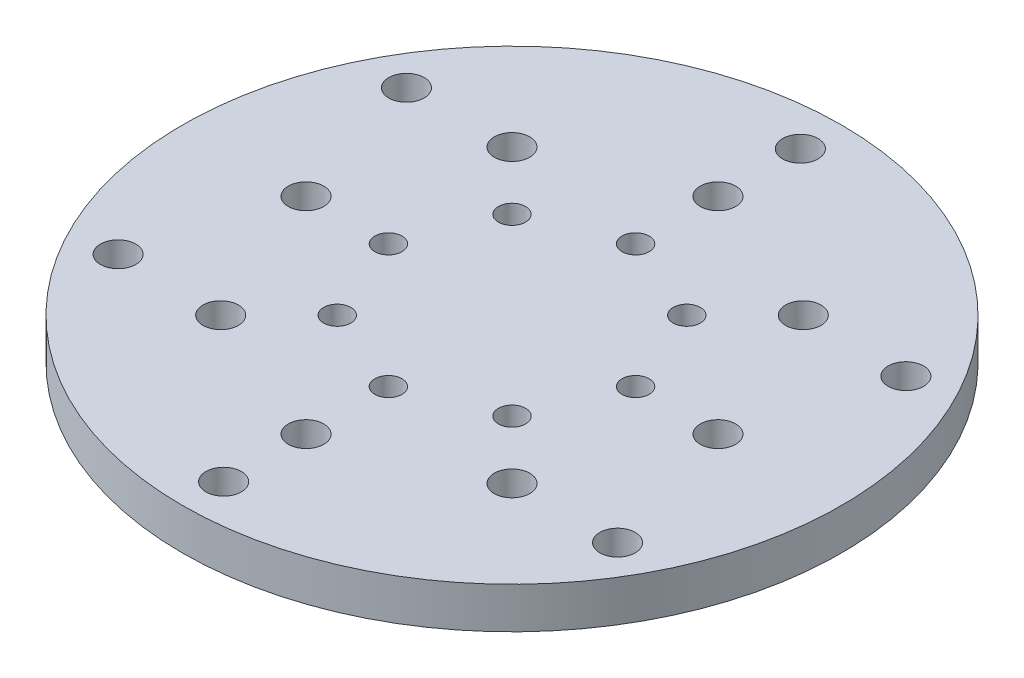
ISO-10303-21;
HEADER;
FILE_DESCRIPTION(('STEP AP214'),'2;1');
FILE_NAME('part.step','',(''),(''),'','','');
FILE_SCHEMA(('AUTOMOTIVE_DESIGN { 1 0 10303 214 1 1 1 1 }'));
ENDSEC;
DATA;
#1=APPLICATION_CONTEXT('core data for automotive mechanical design processes');
#2=APPLICATION_PROTOCOL_DEFINITION('international standard','automotive_design',2000,#1);
#3=PRODUCT_CONTEXT('',#1,'mechanical');
#4=PRODUCT('Part','Part','',(#3));
#5=PRODUCT_RELATED_PRODUCT_CATEGORY('part','',(#4));
#6=PRODUCT_DEFINITION_FORMATION('','',#4);
#7=PRODUCT_DEFINITION_CONTEXT('part definition',#1,'design');
#8=PRODUCT_DEFINITION('design','',#6,#7);
#9=PRODUCT_DEFINITION_SHAPE('','',#8);
#10=(LENGTH_UNIT() NAMED_UNIT(*) SI_UNIT(.MILLI.,.METRE.));
#11=(NAMED_UNIT(*) PLANE_ANGLE_UNIT() SI_UNIT($,.RADIAN.));
#12=(NAMED_UNIT(*) SI_UNIT($,.STERADIAN.) SOLID_ANGLE_UNIT());
#13=UNCERTAINTY_MEASURE_WITH_UNIT(LENGTH_MEASURE(1.E-05),#10,'distance_accuracy_value','');
#14=(GEOMETRIC_REPRESENTATION_CONTEXT(3) GLOBAL_UNCERTAINTY_ASSIGNED_CONTEXT((#13)) GLOBAL_UNIT_ASSIGNED_CONTEXT((#10,
#11,#12)) REPRESENTATION_CONTEXT('',''));
#15=CARTESIAN_POINT('',(0.,0.,0.));
#16=DIRECTION('',(0.,0.,1.));
#17=DIRECTION('',(1.,0.,0.));
#18=AXIS2_PLACEMENT_3D('',#15,#16,#17);
#19=CARTESIAN_POINT('',(-25.,5.,-2.61861100413235E-13));
#20=DIRECTION('',(0.,-1.,0.));
#21=DIRECTION('',(0.,0.,-1.));
#22=AXIS2_PLACEMENT_3D('',#19,#20,#21);
#23=CYLINDRICAL_SURFACE('',#22,2.15);
#24=CARTESIAN_POINT('',(-25.,5.,-2.61861100413235E-13));
#25=DIRECTION('',(0.,1.,0.));
#26=DIRECTION('',(0.,0.,1.));
#27=AXIS2_PLACEMENT_3D('',#24,#25,#26);
#28=CIRCLE('',#27,2.15);
#29=CARTESIAN_POINT('',(-25.,5.,2.14999999999974));
#30=VERTEX_POINT('',#29);
#31=EDGE_CURVE('E54',#30,#30,#28,.T.);
#32=ORIENTED_EDGE('',*,*,#31,.T.);
#33=EDGE_LOOP('',(#32));
#34=FACE_BOUND('',#33,.T.);
#35=CARTESIAN_POINT('',(-25.,0.,-2.61861100413235E-13));
#36=DIRECTION('',(0.,1.,0.));
#37=DIRECTION('',(0.,0.,1.));
#38=AXIS2_PLACEMENT_3D('',#35,#36,#37);
#39=CIRCLE('',#38,2.15);
#40=CARTESIAN_POINT('',(-25.,0.,2.14999999999974));
#41=VERTEX_POINT('',#40);
#42=EDGE_CURVE('E147',#41,#41,#39,.T.);
#43=ORIENTED_EDGE('',*,*,#42,.F.);
#44=EDGE_LOOP('',(#43));
#45=FACE_BOUND('',#44,.T.);
#46=ADVANCED_FACE('F45',(#34,#45),#23,.F.);
#47=CARTESIAN_POINT('',(0.,5.,0.));
#48=DIRECTION('',(0.,-1.,0.));
#49=DIRECTION('',(0.,0.,-1.));
#50=AXIS2_PLACEMENT_3D('',#47,#48,#49);
#51=CYLINDRICAL_SURFACE('',#50,40.);
#52=CARTESIAN_POINT('',(0.,5.,0.));
#53=DIRECTION('',(0.,1.,0.));
#54=DIRECTION('',(0.,0.,1.));
#55=AXIS2_PLACEMENT_3D('',#52,#53,#54);
#56=CIRCLE('',#55,40.);
#57=CARTESIAN_POINT('',(0.,5.,40.));
#58=VERTEX_POINT('',#57);
#59=EDGE_CURVE('E60',#58,#58,#56,.T.);
#60=ORIENTED_EDGE('',*,*,#59,.F.);
#61=EDGE_LOOP('',(#60));
#62=FACE_BOUND('',#61,.T.);
#63=CARTESIAN_POINT('',(0.,0.,0.));
#64=DIRECTION('',(0.,1.,0.));
#65=DIRECTION('',(0.,0.,1.));
#66=AXIS2_PLACEMENT_3D('',#63,#64,#65);
#67=CIRCLE('',#66,40.);
#68=CARTESIAN_POINT('',(0.,0.,40.));
#69=VERTEX_POINT('',#68);
#70=EDGE_CURVE('E144',#69,#69,#67,.T.);
#71=ORIENTED_EDGE('',*,*,#70,.T.);
#72=EDGE_LOOP('',(#71));
#73=FACE_BOUND('',#72,.T.);
#74=ADVANCED_FACE('F245',(#62,#73),#51,.T.);
#75=CARTESIAN_POINT('',(-30.3108891324555,5.,17.4999999999997));
#76=DIRECTION('',(0.,-1.,0.));
#77=DIRECTION('',(0.,0.,-1.));
#78=AXIS2_PLACEMENT_3D('',#75,#76,#77);
#79=CYLINDRICAL_SURFACE('',#78,2.15);
#80=CARTESIAN_POINT('',(-30.3108891324555,5.,17.4999999999997));
#81=DIRECTION('',(0.,1.,0.));
#82=DIRECTION('',(0.,0.,1.));
#83=AXIS2_PLACEMENT_3D('',#80,#81,#82);
#84=CIRCLE('',#83,2.15);
#85=CARTESIAN_POINT('',(-30.3108891324555,5.,19.6499999999997));
#86=VERTEX_POINT('',#85);
#87=EDGE_CURVE('E235',#86,#86,#84,.T.);
#88=ORIENTED_EDGE('',*,*,#87,.T.);
#89=EDGE_LOOP('',(#88));
#90=FACE_BOUND('',#89,.T.);
#91=CARTESIAN_POINT('',(-30.3108891324555,0.,17.4999999999997));
#92=DIRECTION('',(0.,1.,0.));
#93=DIRECTION('',(0.,0.,1.));
#94=AXIS2_PLACEMENT_3D('',#91,#92,#93);
#95=CIRCLE('',#94,2.15);
#96=CARTESIAN_POINT('',(-30.3108891324555,0.,19.6499999999997));
#97=VERTEX_POINT('',#96);
#98=EDGE_CURVE('E140',#97,#97,#95,.T.);
#99=ORIENTED_EDGE('',*,*,#98,.F.);
#100=EDGE_LOOP('',(#99));
#101=FACE_BOUND('',#100,.T.);
#102=ADVANCED_FACE('F248',(#90,#101),#79,.F.);
#103=CARTESIAN_POINT('',(-2.44403693719019E-13,5.,35.));
#104=DIRECTION('',(0.,-1.,0.));
#105=DIRECTION('',(0.,0.,-1.));
#106=AXIS2_PLACEMENT_3D('',#103,#104,#105);
#107=CYLINDRICAL_SURFACE('',#106,2.15);
#108=CARTESIAN_POINT('',(-2.44403693719019E-13,5.,35.));
#109=DIRECTION('',(0.,1.,0.));
#110=DIRECTION('',(0.,0.,1.));
#111=AXIS2_PLACEMENT_3D('',#108,#109,#110);
#112=CIRCLE('',#111,2.15);
#113=CARTESIAN_POINT('',(-2.44403693719019E-13,5.,37.15));
#114=VERTEX_POINT('',#113);
#115=EDGE_CURVE('E231',#114,#114,#112,.T.);
#116=ORIENTED_EDGE('',*,*,#115,.T.);
#117=EDGE_LOOP('',(#116));
#118=FACE_BOUND('',#117,.T.);
#119=CARTESIAN_POINT('',(-2.44403693719019E-13,0.,35.));
#120=DIRECTION('',(0.,1.,0.));
#121=DIRECTION('',(0.,0.,1.));
#122=AXIS2_PLACEMENT_3D('',#119,#120,#121);
#123=CIRCLE('',#122,2.15);
#124=CARTESIAN_POINT('',(-2.44403693719019E-13,0.,37.15));
#125=VERTEX_POINT('',#124);
#126=EDGE_CURVE('E136',#125,#125,#123,.T.);
#127=ORIENTED_EDGE('',*,*,#126,.F.);
#128=EDGE_LOOP('',(#127));
#129=FACE_BOUND('',#128,.T.);
#130=ADVANCED_FACE('F273',(#118,#129),#107,.F.);
#131=CARTESIAN_POINT('',(30.3108891324553,5.,17.5000000000001));
#132=DIRECTION('',(0.,-1.,0.));
#133=DIRECTION('',(0.,0.,-1.));
#134=AXIS2_PLACEMENT_3D('',#131,#132,#133);
#135=CYLINDRICAL_SURFACE('',#134,2.15);
#136=CARTESIAN_POINT('',(30.3108891324553,5.,17.5000000000001));
#137=DIRECTION('',(0.,1.,0.));
#138=DIRECTION('',(0.,0.,1.));
#139=AXIS2_PLACEMENT_3D('',#136,#137,#138);
#140=CIRCLE('',#139,2.15);
#141=CARTESIAN_POINT('',(30.3108891324553,5.,19.6500000000001));
#142=VERTEX_POINT('',#141);
#143=EDGE_CURVE('E227',#142,#142,#140,.T.);
#144=ORIENTED_EDGE('',*,*,#143,.T.);
#145=EDGE_LOOP('',(#144));
#146=FACE_BOUND('',#145,.T.);
#147=CARTESIAN_POINT('',(30.3108891324553,0.,17.5000000000001));
#148=DIRECTION('',(0.,1.,0.));
#149=DIRECTION('',(0.,0.,1.));
#150=AXIS2_PLACEMENT_3D('',#147,#148,#149);
#151=CIRCLE('',#150,2.15);
#152=CARTESIAN_POINT('',(30.3108891324553,0.,19.6500000000001));
#153=VERTEX_POINT('',#152);
#154=EDGE_CURVE('E132',#153,#153,#151,.T.);
#155=ORIENTED_EDGE('',*,*,#154,.F.);
#156=EDGE_LOOP('',(#155));
#157=FACE_BOUND('',#156,.T.);
#158=ADVANCED_FACE('F277',(#146,#157),#135,.F.);
#159=CARTESIAN_POINT('',(30.3108891324554,5.,-17.4999999999999));
#160=DIRECTION('',(0.,-1.,0.));
#161=DIRECTION('',(0.,0.,-1.));
#162=AXIS2_PLACEMENT_3D('',#159,#160,#161);
#163=CYLINDRICAL_SURFACE('',#162,2.15);
#164=CARTESIAN_POINT('',(30.3108891324554,5.,-17.4999999999999));
#165=DIRECTION('',(0.,1.,0.));
#166=DIRECTION('',(0.,0.,1.));
#167=AXIS2_PLACEMENT_3D('',#164,#165,#166);
#168=CIRCLE('',#167,2.15);
#169=CARTESIAN_POINT('',(30.3108891324554,5.,-15.3499999999999));
#170=VERTEX_POINT('',#169);
#171=EDGE_CURVE('E223',#170,#170,#168,.T.);
#172=ORIENTED_EDGE('',*,*,#171,.T.);
#173=EDGE_LOOP('',(#172));
#174=FACE_BOUND('',#173,.T.);
#175=CARTESIAN_POINT('',(30.3108891324554,0.,-17.4999999999999));
#176=DIRECTION('',(0.,1.,0.));
#177=DIRECTION('',(0.,0.,1.));
#178=AXIS2_PLACEMENT_3D('',#175,#176,#177);
#179=CIRCLE('',#178,2.15);
#180=CARTESIAN_POINT('',(30.3108891324554,0.,-15.3499999999999));
#181=VERTEX_POINT('',#180);
#182=EDGE_CURVE('E128',#181,#181,#179,.T.);
#183=ORIENTED_EDGE('',*,*,#182,.F.);
#184=EDGE_LOOP('',(#183));
#185=FACE_BOUND('',#184,.T.);
#186=ADVANCED_FACE('F281',(#174,#185),#163,.F.);
#187=CARTESIAN_POINT('',(0.,5.,-35.));
#188=DIRECTION('',(0.,-1.,0.));
#189=DIRECTION('',(0.,0.,-1.));
#190=AXIS2_PLACEMENT_3D('',#187,#188,#189);
#191=CYLINDRICAL_SURFACE('',#190,2.15);
#192=CARTESIAN_POINT('',(0.,5.,-35.));
#193=DIRECTION('',(0.,1.,0.));
#194=DIRECTION('',(0.,0.,1.));
#195=AXIS2_PLACEMENT_3D('',#192,#193,#194);
#196=CIRCLE('',#195,2.15);
#197=CARTESIAN_POINT('',(0.,5.,-32.85));
#198=VERTEX_POINT('',#197);
#199=EDGE_CURVE('E219',#198,#198,#196,.T.);
#200=ORIENTED_EDGE('',*,*,#199,.T.);
#201=EDGE_LOOP('',(#200));
#202=FACE_BOUND('',#201,.T.);
#203=CARTESIAN_POINT('',(0.,0.,-35.));
#204=DIRECTION('',(0.,1.,0.));
#205=DIRECTION('',(0.,0.,1.));
#206=AXIS2_PLACEMENT_3D('',#203,#204,#205);
#207=CIRCLE('',#206,2.15);
#208=CARTESIAN_POINT('',(0.,0.,-32.85));
#209=VERTEX_POINT('',#208);
#210=EDGE_CURVE('E124',#209,#209,#207,.T.);
#211=ORIENTED_EDGE('',*,*,#210,.F.);
#212=EDGE_LOOP('',(#211));
#213=FACE_BOUND('',#212,.T.);
#214=ADVANCED_FACE('F285',(#202,#213),#191,.F.);
#215=CARTESIAN_POINT('',(-30.3108891324552,5.,-17.5000000000004));
#216=DIRECTION('',(0.,-1.,0.));
#217=DIRECTION('',(0.,0.,-1.));
#218=AXIS2_PLACEMENT_3D('',#215,#216,#217);
#219=CYLINDRICAL_SURFACE('',#218,2.15);
#220=CARTESIAN_POINT('',(-30.3108891324552,5.,-17.5000000000004));
#221=DIRECTION('',(0.,1.,0.));
#222=DIRECTION('',(0.,0.,1.));
#223=AXIS2_PLACEMENT_3D('',#220,#221,#222);
#224=CIRCLE('',#223,2.15);
#225=CARTESIAN_POINT('',(-30.3108891324552,5.,-15.3500000000004));
#226=VERTEX_POINT('',#225);
#227=EDGE_CURVE('E215',#226,#226,#224,.T.);
#228=ORIENTED_EDGE('',*,*,#227,.T.);
#229=EDGE_LOOP('',(#228));
#230=FACE_BOUND('',#229,.T.);
#231=CARTESIAN_POINT('',(-30.3108891324552,0.,-17.5000000000004));
#232=DIRECTION('',(0.,1.,0.));
#233=DIRECTION('',(0.,0.,1.));
#234=AXIS2_PLACEMENT_3D('',#231,#232,#233);
#235=CIRCLE('',#234,2.15);
#236=CARTESIAN_POINT('',(-30.3108891324552,0.,-15.3500000000004));
#237=VERTEX_POINT('',#236);
#238=EDGE_CURVE('E120',#237,#237,#235,.T.);
#239=ORIENTED_EDGE('',*,*,#238,.F.);
#240=EDGE_LOOP('',(#239));
#241=FACE_BOUND('',#240,.T.);
#242=ADVANCED_FACE('F289',(#230,#241),#219,.F.);
#243=CARTESIAN_POINT('',(-17.6776695296638,5.,17.6776695296635));
#244=DIRECTION('',(0.,-1.,0.));
#245=DIRECTION('',(0.,0.,-1.));
#246=AXIS2_PLACEMENT_3D('',#243,#244,#245);
#247=CYLINDRICAL_SURFACE('',#246,2.15);
#248=CARTESIAN_POINT('',(-17.6776695296638,5.,17.6776695296635));
#249=DIRECTION('',(0.,1.,0.));
#250=DIRECTION('',(0.,0.,1.));
#251=AXIS2_PLACEMENT_3D('',#248,#249,#250);
#252=CIRCLE('',#251,2.15);
#253=CARTESIAN_POINT('',(-17.6776695296638,5.,19.8276695296635));
#254=VERTEX_POINT('',#253);
#255=EDGE_CURVE('E211',#254,#254,#252,.T.);
#256=ORIENTED_EDGE('',*,*,#255,.T.);
#257=EDGE_LOOP('',(#256));
#258=FACE_BOUND('',#257,.T.);
#259=CARTESIAN_POINT('',(-17.6776695296638,0.,17.6776695296635));
#260=DIRECTION('',(0.,1.,0.));
#261=DIRECTION('',(0.,0.,1.));
#262=AXIS2_PLACEMENT_3D('',#259,#260,#261);
#263=CIRCLE('',#262,2.15);
#264=CARTESIAN_POINT('',(-17.6776695296638,0.,19.8276695296635));
#265=VERTEX_POINT('',#264);
#266=EDGE_CURVE('E116',#265,#265,#263,.T.);
#267=ORIENTED_EDGE('',*,*,#266,.F.);
#268=EDGE_LOOP('',(#267));
#269=FACE_BOUND('',#268,.T.);
#270=ADVANCED_FACE('F293',(#258,#269),#247,.F.);
#271=CARTESIAN_POINT('',(-1.74574066942157E-13,5.,25.));
#272=DIRECTION('',(0.,-1.,0.));
#273=DIRECTION('',(0.,0.,-1.));
#274=AXIS2_PLACEMENT_3D('',#271,#272,#273);
#275=CYLINDRICAL_SURFACE('',#274,2.15);
#276=CARTESIAN_POINT('',(-1.74574066942157E-13,5.,25.));
#277=DIRECTION('',(0.,1.,0.));
#278=DIRECTION('',(0.,0.,1.));
#279=AXIS2_PLACEMENT_3D('',#276,#277,#278);
#280=CIRCLE('',#279,2.15);
#281=CARTESIAN_POINT('',(-1.74574066942157E-13,5.,27.15));
#282=VERTEX_POINT('',#281);
#283=EDGE_CURVE('E207',#282,#282,#280,.T.);
#284=ORIENTED_EDGE('',*,*,#283,.T.);
#285=EDGE_LOOP('',(#284));
#286=FACE_BOUND('',#285,.T.);
#287=CARTESIAN_POINT('',(-1.74574066942157E-13,0.,25.));
#288=DIRECTION('',(0.,1.,0.));
#289=DIRECTION('',(0.,0.,1.));
#290=AXIS2_PLACEMENT_3D('',#287,#288,#289);
#291=CIRCLE('',#290,2.15);
#292=CARTESIAN_POINT('',(-1.74574066942157E-13,0.,27.15));
#293=VERTEX_POINT('',#292);
#294=EDGE_CURVE('E112',#293,#293,#291,.T.);
#295=ORIENTED_EDGE('',*,*,#294,.F.);
#296=EDGE_LOOP('',(#295));
#297=FACE_BOUND('',#296,.T.);
#298=ADVANCED_FACE('F297',(#286,#297),#275,.F.);
#299=CARTESIAN_POINT('',(17.6776695296636,5.,17.6776695296638));
#300=DIRECTION('',(0.,-1.,0.));
#301=DIRECTION('',(0.,0.,-1.));
#302=AXIS2_PLACEMENT_3D('',#299,#300,#301);
#303=CYLINDRICAL_SURFACE('',#302,2.15);
#304=CARTESIAN_POINT('',(17.6776695296636,5.,17.6776695296638));
#305=DIRECTION('',(0.,1.,0.));
#306=DIRECTION('',(0.,0.,1.));
#307=AXIS2_PLACEMENT_3D('',#304,#305,#306);
#308=CIRCLE('',#307,2.15);
#309=CARTESIAN_POINT('',(17.6776695296636,5.,19.8276695296638));
#310=VERTEX_POINT('',#309);
#311=EDGE_CURVE('E203',#310,#310,#308,.T.);
#312=ORIENTED_EDGE('',*,*,#311,.T.);
#313=EDGE_LOOP('',(#312));
#314=FACE_BOUND('',#313,.T.);
#315=CARTESIAN_POINT('',(17.6776695296636,0.,17.6776695296638));
#316=DIRECTION('',(0.,1.,0.));
#317=DIRECTION('',(0.,0.,1.));
#318=AXIS2_PLACEMENT_3D('',#315,#316,#317);
#319=CIRCLE('',#318,2.15);
#320=CARTESIAN_POINT('',(17.6776695296636,0.,19.8276695296638));
#321=VERTEX_POINT('',#320);
#322=EDGE_CURVE('E108',#321,#321,#319,.T.);
#323=ORIENTED_EDGE('',*,*,#322,.F.);
#324=EDGE_LOOP('',(#323));
#325=FACE_BOUND('',#324,.T.);
#326=ADVANCED_FACE('F301',(#314,#325),#303,.F.);
#327=CARTESIAN_POINT('',(25.,5.,0.));
#328=DIRECTION('',(0.,-1.,0.));
#329=DIRECTION('',(0.,0.,-1.));
#330=AXIS2_PLACEMENT_3D('',#327,#328,#329);
#331=CYLINDRICAL_SURFACE('',#330,2.15);
#332=CARTESIAN_POINT('',(25.,5.,0.));
#333=DIRECTION('',(0.,1.,0.));
#334=DIRECTION('',(0.,0.,1.));
#335=AXIS2_PLACEMENT_3D('',#332,#333,#334);
#336=CIRCLE('',#335,2.15);
#337=CARTESIAN_POINT('',(25.,5.,2.15000000000009));
#338=VERTEX_POINT('',#337);
#339=EDGE_CURVE('E199',#338,#338,#336,.T.);
#340=ORIENTED_EDGE('',*,*,#339,.T.);
#341=EDGE_LOOP('',(#340));
#342=FACE_BOUND('',#341,.T.);
#343=CARTESIAN_POINT('',(25.,0.,0.));
#344=DIRECTION('',(0.,1.,0.));
#345=DIRECTION('',(0.,0.,1.));
#346=AXIS2_PLACEMENT_3D('',#343,#344,#345);
#347=CIRCLE('',#346,2.15);
#348=CARTESIAN_POINT('',(25.,0.,2.15000000000009));
#349=VERTEX_POINT('',#348);
#350=EDGE_CURVE('E104',#349,#349,#347,.T.);
#351=ORIENTED_EDGE('',*,*,#350,.F.);
#352=EDGE_LOOP('',(#351));
#353=FACE_BOUND('',#352,.T.);
#354=ADVANCED_FACE('F305',(#342,#353),#331,.F.);
#355=CARTESIAN_POINT('',(17.6776695296637,5.,-17.6776695296637));
#356=DIRECTION('',(0.,-1.,0.));
#357=DIRECTION('',(0.,0.,-1.));
#358=AXIS2_PLACEMENT_3D('',#355,#356,#357);
#359=CYLINDRICAL_SURFACE('',#358,2.15);
#360=CARTESIAN_POINT('',(17.6776695296637,5.,-17.6776695296637));
#361=DIRECTION('',(0.,1.,0.));
#362=DIRECTION('',(0.,0.,1.));
#363=AXIS2_PLACEMENT_3D('',#360,#361,#362);
#364=CIRCLE('',#363,2.15);
#365=CARTESIAN_POINT('',(17.6776695296637,5.,-15.5276695296637));
#366=VERTEX_POINT('',#365);
#367=EDGE_CURVE('E195',#366,#366,#364,.T.);
#368=ORIENTED_EDGE('',*,*,#367,.T.);
#369=EDGE_LOOP('',(#368));
#370=FACE_BOUND('',#369,.T.);
#371=CARTESIAN_POINT('',(17.6776695296637,0.,-17.6776695296637));
#372=DIRECTION('',(0.,1.,0.));
#373=DIRECTION('',(0.,0.,1.));
#374=AXIS2_PLACEMENT_3D('',#371,#372,#373);
#375=CIRCLE('',#374,2.15);
#376=CARTESIAN_POINT('',(17.6776695296637,0.,-15.5276695296637));
#377=VERTEX_POINT('',#376);
#378=EDGE_CURVE('E100',#377,#377,#375,.T.);
#379=ORIENTED_EDGE('',*,*,#378,.F.);
#380=EDGE_LOOP('',(#379));
#381=FACE_BOUND('',#380,.T.);
#382=ADVANCED_FACE('F309',(#370,#381),#359,.F.);
#383=CARTESIAN_POINT('',(0.,5.,-25.));
#384=DIRECTION('',(0.,-1.,0.));
#385=DIRECTION('',(0.,0.,-1.));
#386=AXIS2_PLACEMENT_3D('',#383,#384,#385);
#387=CYLINDRICAL_SURFACE('',#386,2.15);
#388=CARTESIAN_POINT('',(0.,5.,-25.));
#389=DIRECTION('',(0.,1.,0.));
#390=DIRECTION('',(0.,0.,1.));
#391=AXIS2_PLACEMENT_3D('',#388,#389,#390);
#392=CIRCLE('',#391,2.15);
#393=CARTESIAN_POINT('',(0.,5.,-22.85));
#394=VERTEX_POINT('',#393);
#395=EDGE_CURVE('E191',#394,#394,#392,.T.);
#396=ORIENTED_EDGE('',*,*,#395,.T.);
#397=EDGE_LOOP('',(#396));
#398=FACE_BOUND('',#397,.T.);
#399=CARTESIAN_POINT('',(0.,0.,-25.));
#400=DIRECTION('',(0.,1.,0.));
#401=DIRECTION('',(0.,0.,1.));
#402=AXIS2_PLACEMENT_3D('',#399,#400,#401);
#403=CIRCLE('',#402,2.15);
#404=CARTESIAN_POINT('',(0.,0.,-22.85));
#405=VERTEX_POINT('',#404);
#406=EDGE_CURVE('E96',#405,#405,#403,.T.);
#407=ORIENTED_EDGE('',*,*,#406,.F.);
#408=EDGE_LOOP('',(#407));
#409=FACE_BOUND('',#408,.T.);
#410=ADVANCED_FACE('F313',(#398,#409),#387,.F.);
#411=CARTESIAN_POINT('',(-17.6776695296635,5.,-17.6776695296639));
#412=DIRECTION('',(0.,-1.,0.));
#413=DIRECTION('',(0.,0.,-1.));
#414=AXIS2_PLACEMENT_3D('',#411,#412,#413);
#415=CYLINDRICAL_SURFACE('',#414,2.15);
#416=CARTESIAN_POINT('',(-17.6776695296635,5.,-17.6776695296639));
#417=DIRECTION('',(0.,1.,0.));
#418=DIRECTION('',(0.,0.,1.));
#419=AXIS2_PLACEMENT_3D('',#416,#417,#418);
#420=CIRCLE('',#419,2.15);
#421=CARTESIAN_POINT('',(-17.6776695296635,5.,-15.5276695296639));
#422=VERTEX_POINT('',#421);
#423=EDGE_CURVE('E187',#422,#422,#420,.T.);
#424=ORIENTED_EDGE('',*,*,#423,.T.);
#425=EDGE_LOOP('',(#424));
#426=FACE_BOUND('',#425,.T.);
#427=CARTESIAN_POINT('',(-17.6776695296635,0.,-17.6776695296639));
#428=DIRECTION('',(0.,1.,0.));
#429=DIRECTION('',(0.,0.,1.));
#430=AXIS2_PLACEMENT_3D('',#427,#428,#429);
#431=CIRCLE('',#430,2.15);
#432=CARTESIAN_POINT('',(-17.6776695296635,0.,-15.5276695296639));
#433=VERTEX_POINT('',#432);
#434=EDGE_CURVE('E92',#433,#433,#431,.T.);
#435=ORIENTED_EDGE('',*,*,#434,.F.);
#436=EDGE_LOOP('',(#435));
#437=FACE_BOUND('',#436,.T.);
#438=ADVANCED_FACE('F317',(#426,#437),#415,.F.);
#439=CARTESIAN_POINT('',(-10.6066017177983,5.,10.6066017177981));
#440=DIRECTION('',(0.,-1.,0.));
#441=DIRECTION('',(0.,0.,-1.));
#442=AXIS2_PLACEMENT_3D('',#439,#440,#441);
#443=CYLINDRICAL_SURFACE('',#442,1.65);
#444=CARTESIAN_POINT('',(-10.6066017177983,5.,10.6066017177981));
#445=DIRECTION('',(0.,1.,0.));
#446=DIRECTION('',(0.,0.,1.));
#447=AXIS2_PLACEMENT_3D('',#444,#445,#446);
#448=CIRCLE('',#447,1.65);
#449=CARTESIAN_POINT('',(-10.6066017177983,5.,12.2566017177981));
#450=VERTEX_POINT('',#449);
#451=EDGE_CURVE('E183',#450,#450,#448,.T.);
#452=ORIENTED_EDGE('',*,*,#451,.T.);
#453=EDGE_LOOP('',(#452));
#454=FACE_BOUND('',#453,.T.);
#455=CARTESIAN_POINT('',(-10.6066017177983,0.,10.6066017177981));
#456=DIRECTION('',(0.,1.,0.));
#457=DIRECTION('',(0.,0.,1.));
#458=AXIS2_PLACEMENT_3D('',#455,#456,#457);
#459=CIRCLE('',#458,1.65);
#460=CARTESIAN_POINT('',(-10.6066017177983,0.,12.2566017177981));
#461=VERTEX_POINT('',#460);
#462=EDGE_CURVE('E88',#461,#461,#459,.T.);
#463=ORIENTED_EDGE('',*,*,#462,.F.);
#464=EDGE_LOOP('',(#463));
#465=FACE_BOUND('',#464,.T.);
#466=ADVANCED_FACE('F321',(#454,#465),#443,.F.);
#467=CARTESIAN_POINT('',(-1.04744440165294E-13,5.,15.));
#468=DIRECTION('',(0.,-1.,0.));
#469=DIRECTION('',(0.,0.,-1.));
#470=AXIS2_PLACEMENT_3D('',#467,#468,#469);
#471=CYLINDRICAL_SURFACE('',#470,1.65);
#472=CARTESIAN_POINT('',(-1.04744440165294E-13,5.,15.));
#473=DIRECTION('',(0.,1.,0.));
#474=DIRECTION('',(0.,0.,1.));
#475=AXIS2_PLACEMENT_3D('',#472,#473,#474);
#476=CIRCLE('',#475,1.65);
#477=CARTESIAN_POINT('',(-1.04744440165294E-13,5.,16.65));
#478=VERTEX_POINT('',#477);
#479=EDGE_CURVE('E179',#478,#478,#476,.T.);
#480=ORIENTED_EDGE('',*,*,#479,.T.);
#481=EDGE_LOOP('',(#480));
#482=FACE_BOUND('',#481,.T.);
#483=CARTESIAN_POINT('',(-1.04744440165294E-13,0.,15.));
#484=DIRECTION('',(0.,1.,0.));
#485=DIRECTION('',(0.,0.,1.));
#486=AXIS2_PLACEMENT_3D('',#483,#484,#485);
#487=CIRCLE('',#486,1.65);
#488=CARTESIAN_POINT('',(-1.04744440165294E-13,0.,16.65));
#489=VERTEX_POINT('',#488);
#490=EDGE_CURVE('E84',#489,#489,#487,.T.);
#491=ORIENTED_EDGE('',*,*,#490,.F.);
#492=EDGE_LOOP('',(#491));
#493=FACE_BOUND('',#492,.T.);
#494=ADVANCED_FACE('F325',(#482,#493),#471,.F.);
#495=CARTESIAN_POINT('',(10.6066017177982,5.,10.6066017177983));
#496=DIRECTION('',(0.,-1.,0.));
#497=DIRECTION('',(0.,0.,-1.));
#498=AXIS2_PLACEMENT_3D('',#495,#496,#497);
#499=CYLINDRICAL_SURFACE('',#498,1.65);
#500=CARTESIAN_POINT('',(10.6066017177982,5.,10.6066017177983));
#501=DIRECTION('',(0.,1.,0.));
#502=DIRECTION('',(0.,0.,1.));
#503=AXIS2_PLACEMENT_3D('',#500,#501,#502);
#504=CIRCLE('',#503,1.65);
#505=CARTESIAN_POINT('',(10.6066017177982,5.,12.2566017177983));
#506=VERTEX_POINT('',#505);
#507=EDGE_CURVE('E175',#506,#506,#504,.T.);
#508=ORIENTED_EDGE('',*,*,#507,.T.);
#509=EDGE_LOOP('',(#508));
#510=FACE_BOUND('',#509,.T.);
#511=CARTESIAN_POINT('',(10.6066017177982,0.,10.6066017177983));
#512=DIRECTION('',(0.,1.,0.));
#513=DIRECTION('',(0.,0.,1.));
#514=AXIS2_PLACEMENT_3D('',#511,#512,#513);
#515=CIRCLE('',#514,1.65);
#516=CARTESIAN_POINT('',(10.6066017177982,0.,12.2566017177983));
#517=VERTEX_POINT('',#516);
#518=EDGE_CURVE('E80',#517,#517,#515,.T.);
#519=ORIENTED_EDGE('',*,*,#518,.F.);
#520=EDGE_LOOP('',(#519));
#521=FACE_BOUND('',#520,.T.);
#522=ADVANCED_FACE('F329',(#510,#521),#499,.F.);
#523=CARTESIAN_POINT('',(15.,5.,0.));
#524=DIRECTION('',(0.,-1.,0.));
#525=DIRECTION('',(0.,0.,-1.));
#526=AXIS2_PLACEMENT_3D('',#523,#524,#525);
#527=CYLINDRICAL_SURFACE('',#526,1.65);
#528=CARTESIAN_POINT('',(15.,5.,0.));
#529=DIRECTION('',(0.,1.,0.));
#530=DIRECTION('',(0.,0.,1.));
#531=AXIS2_PLACEMENT_3D('',#528,#529,#530);
#532=CIRCLE('',#531,1.65);
#533=CARTESIAN_POINT('',(15.,5.,1.65000000000005));
#534=VERTEX_POINT('',#533);
#535=EDGE_CURVE('E171',#534,#534,#532,.T.);
#536=ORIENTED_EDGE('',*,*,#535,.T.);
#537=EDGE_LOOP('',(#536));
#538=FACE_BOUND('',#537,.T.);
#539=CARTESIAN_POINT('',(15.,0.,0.));
#540=DIRECTION('',(0.,1.,0.));
#541=DIRECTION('',(0.,0.,1.));
#542=AXIS2_PLACEMENT_3D('',#539,#540,#541);
#543=CIRCLE('',#542,1.65);
#544=CARTESIAN_POINT('',(15.,0.,1.65000000000005));
#545=VERTEX_POINT('',#544);
#546=EDGE_CURVE('E76',#545,#545,#543,.T.);
#547=ORIENTED_EDGE('',*,*,#546,.F.);
#548=EDGE_LOOP('',(#547));
#549=FACE_BOUND('',#548,.T.);
#550=ADVANCED_FACE('F333',(#538,#549),#527,.F.);
#551=CARTESIAN_POINT('',(10.6066017177982,5.,-10.6066017177982));
#552=DIRECTION('',(0.,-1.,0.));
#553=DIRECTION('',(0.,0.,-1.));
#554=AXIS2_PLACEMENT_3D('',#551,#552,#553);
#555=CYLINDRICAL_SURFACE('',#554,1.65);
#556=CARTESIAN_POINT('',(10.6066017177982,5.,-10.6066017177982));
#557=DIRECTION('',(0.,1.,0.));
#558=DIRECTION('',(0.,0.,1.));
#559=AXIS2_PLACEMENT_3D('',#556,#557,#558);
#560=CIRCLE('',#559,1.65);
#561=CARTESIAN_POINT('',(10.6066017177982,5.,-8.95660171779819));
#562=VERTEX_POINT('',#561);
#563=EDGE_CURVE('E165',#562,#562,#560,.T.);
#564=ORIENTED_EDGE('',*,*,#563,.T.);
#565=EDGE_LOOP('',(#564));
#566=FACE_BOUND('',#565,.T.);
#567=CARTESIAN_POINT('',(10.6066017177982,0.,-10.6066017177982));
#568=DIRECTION('',(0.,1.,0.));
#569=DIRECTION('',(0.,0.,1.));
#570=AXIS2_PLACEMENT_3D('',#567,#568,#569);
#571=CIRCLE('',#570,1.65);
#572=CARTESIAN_POINT('',(10.6066017177982,0.,-8.95660171779819));
#573=VERTEX_POINT('',#572);
#574=EDGE_CURVE('E72',#573,#573,#571,.T.);
#575=ORIENTED_EDGE('',*,*,#574,.F.);
#576=EDGE_LOOP('',(#575));
#577=FACE_BOUND('',#576,.T.);
#578=ADVANCED_FACE('F337',(#566,#577),#555,.F.);
#579=CARTESIAN_POINT('',(0.,5.,-15.));
#580=DIRECTION('',(0.,-1.,0.));
#581=DIRECTION('',(0.,0.,-1.));
#582=AXIS2_PLACEMENT_3D('',#579,#580,#581);
#583=CYLINDRICAL_SURFACE('',#582,1.65);
#584=CARTESIAN_POINT('',(0.,5.,-15.));
#585=DIRECTION('',(0.,1.,0.));
#586=DIRECTION('',(0.,0.,1.));
#587=AXIS2_PLACEMENT_3D('',#584,#585,#586);
#588=CIRCLE('',#587,1.65);
#589=CARTESIAN_POINT('',(0.,5.,-13.35));
#590=VERTEX_POINT('',#589);
#591=EDGE_CURVE('E159',#590,#590,#588,.T.);
#592=ORIENTED_EDGE('',*,*,#591,.T.);
#593=EDGE_LOOP('',(#592));
#594=FACE_BOUND('',#593,.T.);
#595=CARTESIAN_POINT('',(0.,0.,-15.));
#596=DIRECTION('',(0.,1.,0.));
#597=DIRECTION('',(0.,0.,1.));
#598=AXIS2_PLACEMENT_3D('',#595,#596,#597);
#599=CIRCLE('',#598,1.65);
#600=CARTESIAN_POINT('',(0.,0.,-13.35));
#601=VERTEX_POINT('',#600);
#602=EDGE_CURVE('E68',#601,#601,#599,.T.);
#603=ORIENTED_EDGE('',*,*,#602,.F.);
#604=EDGE_LOOP('',(#603));
#605=FACE_BOUND('',#604,.T.);
#606=ADVANCED_FACE('F340',(#594,#605),#583,.F.);
#607=CARTESIAN_POINT('',(-10.6066017177981,5.,-10.6066017177983));
#608=DIRECTION('',(0.,-1.,0.));
#609=DIRECTION('',(0.,0.,-1.));
#610=AXIS2_PLACEMENT_3D('',#607,#608,#609);
#611=CYLINDRICAL_SURFACE('',#610,1.65);
#612=CARTESIAN_POINT('',(-10.6066017177981,5.,-10.6066017177983));
#613=DIRECTION('',(0.,1.,0.));
#614=DIRECTION('',(0.,0.,1.));
#615=AXIS2_PLACEMENT_3D('',#612,#613,#614);
#616=CIRCLE('',#615,1.65);
#617=CARTESIAN_POINT('',(-10.6066017177981,5.,-8.95660171779834));
#618=VERTEX_POINT('',#617);
#619=EDGE_CURVE('E154',#618,#618,#616,.T.);
#620=ORIENTED_EDGE('',*,*,#619,.T.);
#621=EDGE_LOOP('',(#620));
#622=FACE_BOUND('',#621,.T.);
#623=CARTESIAN_POINT('',(-10.6066017177981,0.,-10.6066017177983));
#624=DIRECTION('',(0.,1.,0.));
#625=DIRECTION('',(0.,0.,1.));
#626=AXIS2_PLACEMENT_3D('',#623,#624,#625);
#627=CIRCLE('',#626,1.65);
#628=CARTESIAN_POINT('',(-10.6066017177981,0.,-8.95660171779834));
#629=VERTEX_POINT('',#628);
#630=EDGE_CURVE('E64',#629,#629,#627,.T.);
#631=ORIENTED_EDGE('',*,*,#630,.F.);
#632=EDGE_LOOP('',(#631));
#633=FACE_BOUND('',#632,.T.);
#634=ADVANCED_FACE('F47',(#622,#633),#611,.F.);
#635=CARTESIAN_POINT('',(-15.,5.,-1.57116660247941E-13));
#636=DIRECTION('',(0.,-1.,0.));
#637=DIRECTION('',(0.,0.,-1.));
#638=AXIS2_PLACEMENT_3D('',#635,#636,#637);
#639=CYLINDRICAL_SURFACE('',#638,1.65);
#640=CARTESIAN_POINT('',(-15.,5.,-1.57116660247941E-13));
#641=DIRECTION('',(0.,1.,0.));
#642=DIRECTION('',(0.,0.,1.));
#643=AXIS2_PLACEMENT_3D('',#640,#641,#642);
#644=CIRCLE('',#643,1.65);
#645=CARTESIAN_POINT('',(-15.,5.,1.64999999999984));
#646=VERTEX_POINT('',#645);
#647=EDGE_CURVE('E10',#646,#646,#644,.T.);
#648=ORIENTED_EDGE('',*,*,#647,.T.);
#649=EDGE_LOOP('',(#648));
#650=FACE_BOUND('',#649,.T.);
#651=CARTESIAN_POINT('',(-15.,0.,-1.57116660247941E-13));
#652=DIRECTION('',(0.,1.,0.));
#653=DIRECTION('',(0.,0.,1.));
#654=AXIS2_PLACEMENT_3D('',#651,#652,#653);
#655=CIRCLE('',#654,1.65);
#656=CARTESIAN_POINT('',(-15.,0.,1.64999999999984));
#657=VERTEX_POINT('',#656);
#658=EDGE_CURVE('E49',#657,#657,#655,.T.);
#659=ORIENTED_EDGE('',*,*,#658,.F.);
#660=EDGE_LOOP('',(#659));
#661=FACE_BOUND('',#660,.T.);
#662=ADVANCED_FACE('F259',(#650,#661),#639,.F.);
#663=CARTESIAN_POINT('',(0.,5.,0.));
#664=DIRECTION('',(0.,1.,0.));
#665=DIRECTION('',(0.,0.,1.));
#666=AXIS2_PLACEMENT_3D('',#663,#664,#665);
#667=PLANE('',#666);
#668=ORIENTED_EDGE('',*,*,#619,.F.);
#669=EDGE_LOOP('',(#668));
#670=FACE_BOUND('',#669,.T.);
#671=ORIENTED_EDGE('',*,*,#591,.F.);
#672=EDGE_LOOP('',(#671));
#673=FACE_BOUND('',#672,.T.);
#674=ORIENTED_EDGE('',*,*,#563,.F.);
#675=EDGE_LOOP('',(#674));
#676=FACE_BOUND('',#675,.T.);
#677=ORIENTED_EDGE('',*,*,#535,.F.);
#678=EDGE_LOOP('',(#677));
#679=FACE_BOUND('',#678,.T.);
#680=ORIENTED_EDGE('',*,*,#507,.F.);
#681=EDGE_LOOP('',(#680));
#682=FACE_BOUND('',#681,.T.);
#683=ORIENTED_EDGE('',*,*,#479,.F.);
#684=EDGE_LOOP('',(#683));
#685=FACE_BOUND('',#684,.T.);
#686=ORIENTED_EDGE('',*,*,#451,.F.);
#687=EDGE_LOOP('',(#686));
#688=FACE_BOUND('',#687,.T.);
#689=ORIENTED_EDGE('',*,*,#423,.F.);
#690=EDGE_LOOP('',(#689));
#691=FACE_BOUND('',#690,.T.);
#692=ORIENTED_EDGE('',*,*,#395,.F.);
#693=EDGE_LOOP('',(#692));
#694=FACE_BOUND('',#693,.T.);
#695=ORIENTED_EDGE('',*,*,#367,.F.);
#696=EDGE_LOOP('',(#695));
#697=FACE_BOUND('',#696,.T.);
#698=ORIENTED_EDGE('',*,*,#339,.F.);
#699=EDGE_LOOP('',(#698));
#700=FACE_BOUND('',#699,.T.);
#701=ORIENTED_EDGE('',*,*,#311,.F.);
#702=EDGE_LOOP('',(#701));
#703=FACE_BOUND('',#702,.T.);
#704=ORIENTED_EDGE('',*,*,#283,.F.);
#705=EDGE_LOOP('',(#704));
#706=FACE_BOUND('',#705,.T.);
#707=ORIENTED_EDGE('',*,*,#255,.F.);
#708=EDGE_LOOP('',(#707));
#709=FACE_BOUND('',#708,.T.);
#710=ORIENTED_EDGE('',*,*,#227,.F.);
#711=EDGE_LOOP('',(#710));
#712=FACE_BOUND('',#711,.T.);
#713=ORIENTED_EDGE('',*,*,#199,.F.);
#714=EDGE_LOOP('',(#713));
#715=FACE_BOUND('',#714,.T.);
#716=ORIENTED_EDGE('',*,*,#171,.F.);
#717=EDGE_LOOP('',(#716));
#718=FACE_BOUND('',#717,.T.);
#719=ORIENTED_EDGE('',*,*,#143,.F.);
#720=EDGE_LOOP('',(#719));
#721=FACE_BOUND('',#720,.T.);
#722=ORIENTED_EDGE('',*,*,#115,.F.);
#723=EDGE_LOOP('',(#722));
#724=FACE_BOUND('',#723,.T.);
#725=ORIENTED_EDGE('',*,*,#87,.F.);
#726=EDGE_LOOP('',(#725));
#727=FACE_BOUND('',#726,.T.);
#728=ORIENTED_EDGE('',*,*,#59,.T.);
#729=EDGE_LOOP('',(#728));
#730=FACE_BOUND('',#729,.T.);
#731=ORIENTED_EDGE('',*,*,#31,.F.);
#732=EDGE_LOOP('',(#731));
#733=FACE_BOUND('',#732,.T.);
#734=ORIENTED_EDGE('',*,*,#647,.F.);
#735=EDGE_LOOP('',(#734));
#736=FACE_BOUND('',#735,.T.);
#737=ADVANCED_FACE('F242',(#670,#673,#676,#679,#682,#685,#688,#691,#694,#697,#700,#703,#706,
#709,#712,#715,#718,#721,#724,#727,#730,#733,#736),#667,.T.);
#738=CARTESIAN_POINT('',(0.,0.,0.));
#739=DIRECTION('',(0.,1.,0.));
#740=DIRECTION('',(0.,0.,1.));
#741=AXIS2_PLACEMENT_3D('',#738,#739,#740);
#742=PLANE('',#741);
#743=ORIENTED_EDGE('',*,*,#630,.T.);
#744=EDGE_LOOP('',(#743));
#745=FACE_BOUND('',#744,.T.);
#746=ORIENTED_EDGE('',*,*,#602,.T.);
#747=EDGE_LOOP('',(#746));
#748=FACE_BOUND('',#747,.T.);
#749=ORIENTED_EDGE('',*,*,#574,.T.);
#750=EDGE_LOOP('',(#749));
#751=FACE_BOUND('',#750,.T.);
#752=ORIENTED_EDGE('',*,*,#546,.T.);
#753=EDGE_LOOP('',(#752));
#754=FACE_BOUND('',#753,.T.);
#755=ORIENTED_EDGE('',*,*,#518,.T.);
#756=EDGE_LOOP('',(#755));
#757=FACE_BOUND('',#756,.T.);
#758=ORIENTED_EDGE('',*,*,#490,.T.);
#759=EDGE_LOOP('',(#758));
#760=FACE_BOUND('',#759,.T.);
#761=ORIENTED_EDGE('',*,*,#462,.T.);
#762=EDGE_LOOP('',(#761));
#763=FACE_BOUND('',#762,.T.);
#764=ORIENTED_EDGE('',*,*,#434,.T.);
#765=EDGE_LOOP('',(#764));
#766=FACE_BOUND('',#765,.T.);
#767=ORIENTED_EDGE('',*,*,#406,.T.);
#768=EDGE_LOOP('',(#767));
#769=FACE_BOUND('',#768,.T.);
#770=ORIENTED_EDGE('',*,*,#378,.T.);
#771=EDGE_LOOP('',(#770));
#772=FACE_BOUND('',#771,.T.);
#773=ORIENTED_EDGE('',*,*,#350,.T.);
#774=EDGE_LOOP('',(#773));
#775=FACE_BOUND('',#774,.T.);
#776=ORIENTED_EDGE('',*,*,#322,.T.);
#777=EDGE_LOOP('',(#776));
#778=FACE_BOUND('',#777,.T.);
#779=ORIENTED_EDGE('',*,*,#294,.T.);
#780=EDGE_LOOP('',(#779));
#781=FACE_BOUND('',#780,.T.);
#782=ORIENTED_EDGE('',*,*,#266,.T.);
#783=EDGE_LOOP('',(#782));
#784=FACE_BOUND('',#783,.T.);
#785=ORIENTED_EDGE('',*,*,#238,.T.);
#786=EDGE_LOOP('',(#785));
#787=FACE_BOUND('',#786,.T.);
#788=ORIENTED_EDGE('',*,*,#210,.T.);
#789=EDGE_LOOP('',(#788));
#790=FACE_BOUND('',#789,.T.);
#791=ORIENTED_EDGE('',*,*,#182,.T.);
#792=EDGE_LOOP('',(#791));
#793=FACE_BOUND('',#792,.T.);
#794=ORIENTED_EDGE('',*,*,#154,.T.);
#795=EDGE_LOOP('',(#794));
#796=FACE_BOUND('',#795,.T.);
#797=ORIENTED_EDGE('',*,*,#126,.T.);
#798=EDGE_LOOP('',(#797));
#799=FACE_BOUND('',#798,.T.);
#800=ORIENTED_EDGE('',*,*,#98,.T.);
#801=EDGE_LOOP('',(#800));
#802=FACE_BOUND('',#801,.T.);
#803=ORIENTED_EDGE('',*,*,#70,.F.);
#804=EDGE_LOOP('',(#803));
#805=FACE_BOUND('',#804,.T.);
#806=ORIENTED_EDGE('',*,*,#42,.T.);
#807=EDGE_LOOP('',(#806));
#808=FACE_BOUND('',#807,.T.);
#809=ORIENTED_EDGE('',*,*,#658,.T.);
#810=EDGE_LOOP('',(#809));
#811=FACE_BOUND('',#810,.T.);
#812=ADVANCED_FACE('F252',(#745,#748,#751,#754,#757,#760,#763,#766,#769,#772,#775,#778,#781,
#784,#787,#790,#793,#796,#799,#802,#805,#808,#811),#742,.F.);
#813=CLOSED_SHELL('',(#46,#74,#102,#130,#158,#186,#214,#242,#270,#298,#326,#354,#382,#410,#438,
#466,#494,#522,#550,#578,#606,#634,#662,#737,#812));
#814=MANIFOLD_SOLID_BREP('B2',#813);
#815=ADVANCED_BREP_SHAPE_REPRESENTATION('',(#18,#814),#14);
#816=SHAPE_DEFINITION_REPRESENTATION(#9,#815);
ENDSEC;
END-ISO-10303-21;
